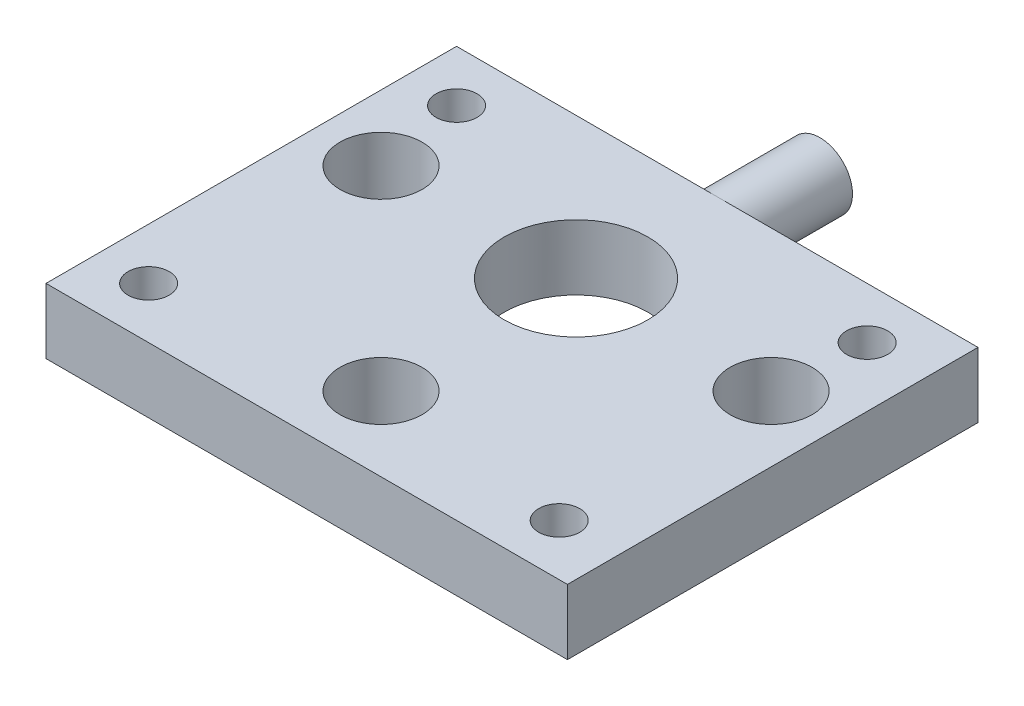
ISO-10303-21;
HEADER;
FILE_DESCRIPTION(('STEP AP214'),'2;1');
FILE_NAME('part.step','',(''),(''),'','','');
FILE_SCHEMA(('AUTOMOTIVE_DESIGN { 1 0 10303 214 1 1 1 1 }'));
ENDSEC;
DATA;
#1=APPLICATION_CONTEXT('core data for automotive mechanical design processes');
#2=APPLICATION_PROTOCOL_DEFINITION('international standard','automotive_design',2000,#1);
#3=PRODUCT_CONTEXT('',#1,'mechanical');
#4=PRODUCT('Part','Part','',(#3));
#5=PRODUCT_RELATED_PRODUCT_CATEGORY('part','',(#4));
#6=PRODUCT_DEFINITION_FORMATION('','',#4);
#7=PRODUCT_DEFINITION_CONTEXT('part definition',#1,'design');
#8=PRODUCT_DEFINITION('design','',#6,#7);
#9=PRODUCT_DEFINITION_SHAPE('','',#8);
#10=(LENGTH_UNIT() NAMED_UNIT(*) SI_UNIT(.MILLI.,.METRE.));
#11=(NAMED_UNIT(*) PLANE_ANGLE_UNIT() SI_UNIT($,.RADIAN.));
#12=(NAMED_UNIT(*) SI_UNIT($,.STERADIAN.) SOLID_ANGLE_UNIT());
#13=UNCERTAINTY_MEASURE_WITH_UNIT(LENGTH_MEASURE(1.E-05),#10,'distance_accuracy_value','');
#14=(GEOMETRIC_REPRESENTATION_CONTEXT(3) GLOBAL_UNCERTAINTY_ASSIGNED_CONTEXT((#13)) GLOBAL_UNIT_ASSIGNED_CONTEXT((#10,
#11,#12)) REPRESENTATION_CONTEXT('',''));
#15=CARTESIAN_POINT('',(0.,0.,0.));
#16=DIRECTION('',(0.,0.,1.));
#17=DIRECTION('',(1.,0.,0.));
#18=AXIS2_PLACEMENT_3D('',#15,#16,#17);
#19=CARTESIAN_POINT('',(0.,10.,-33.2265724491529));
#20=DIRECTION('',(0.,0.,-1.));
#21=DIRECTION('',(-1.,0.,0.));
#22=AXIS2_PLACEMENT_3D('',#19,#20,#21);
#23=PLANE('',#22);
#24=CARTESIAN_POINT('',(0.,3.175,-33.2265724491529));
#25=DIRECTION('',(0.,0.,-1.));
#26=DIRECTION('',(-1.,0.,0.));
#27=AXIS2_PLACEMENT_3D('',#24,#25,#26);
#28=CIRCLE('',#27,3.175);
#29=CARTESIAN_POINT('',(0.,6.35,-33.2265724491529));
#30=VERTEX_POINT('',#29);
#31=CARTESIAN_POINT('',(0.,0.,-33.2265724491529));
#32=VERTEX_POINT('',#31);
#33=EDGE_CURVE('E45',#30,#32,#28,.T.);
#34=ORIENTED_EDGE('',*,*,#33,.F.);
#35=DIRECTION('',(-1.,0.,0.));
#36=VECTOR('',#35,1.);
#37=CARTESIAN_POINT('',(0.,6.35,-33.2265724491529));
#38=LINE('',#37,#36);
#39=CARTESIAN_POINT('',(25.4,6.35,-33.2265724491529));
#40=VERTEX_POINT('',#39);
#41=EDGE_CURVE('E83',#40,#30,#38,.T.);
#42=ORIENTED_EDGE('',*,*,#41,.F.);
#43=DIRECTION('',(0.,-1.,0.));
#44=VECTOR('',#43,1.);
#45=CARTESIAN_POINT('',(25.4,10.,-33.2265724491529));
#46=LINE('',#45,#44);
#47=CARTESIAN_POINT('',(25.4,0.,-33.2265724491529));
#48=VERTEX_POINT('',#47);
#49=EDGE_CURVE('E99',#40,#48,#46,.T.);
#50=ORIENTED_EDGE('',*,*,#49,.T.);
#51=DIRECTION('',(1.,0.,0.));
#52=VECTOR('',#51,1.);
#53=CARTESIAN_POINT('',(0.,0.,-33.2265724491529));
#54=LINE('',#53,#52);
#55=EDGE_CURVE('E57',#32,#48,#54,.T.);
#56=ORIENTED_EDGE('',*,*,#55,.F.);
#57=EDGE_LOOP('',(#34,#42,#50,#56));
#58=FACE_BOUND('',#57,.T.);
#59=ADVANCED_FACE('F35',(#58),#23,.T.);
#60=CARTESIAN_POINT('',(25.4,6.35,-40.));
#61=DIRECTION('',(-1.,0.,0.));
#62=DIRECTION('',(0.,0.,1.));
#63=AXIS2_PLACEMENT_3D('',#60,#61,#62);
#64=PLANE('',#63);
#65=ORIENTED_EDGE('',*,*,#49,.F.);
#66=DIRECTION('',(0.,0.,-1.));
#67=VECTOR('',#66,1.);
#68=CARTESIAN_POINT('',(25.4,6.35,-40.));
#69=LINE('',#68,#67);
#70=CARTESIAN_POINT('',(25.4,6.35,6.77342755084709));
#71=VERTEX_POINT('',#70);
#72=EDGE_CURVE('E89',#71,#40,#69,.T.);
#73=ORIENTED_EDGE('',*,*,#72,.F.);
#74=DIRECTION('',(0.,1.,0.));
#75=VECTOR('',#74,1.);
#76=CARTESIAN_POINT('',(25.4,-3.65,6.77342755084709));
#77=LINE('',#76,#75);
#78=CARTESIAN_POINT('',(25.4,0.,6.77342755084709));
#79=VERTEX_POINT('',#78);
#80=EDGE_CURVE('E184',#79,#71,#77,.T.);
#81=ORIENTED_EDGE('',*,*,#80,.F.);
#82=DIRECTION('',(0.,0.,-1.));
#83=VECTOR('',#82,1.);
#84=CARTESIAN_POINT('',(25.4,0.,-40.));
#85=LINE('',#84,#83);
#86=EDGE_CURVE('E159',#79,#48,#85,.T.);
#87=ORIENTED_EDGE('',*,*,#86,.T.);
#88=EDGE_LOOP('',(#65,#73,#81,#87));
#89=FACE_BOUND('',#88,.T.);
#90=ADVANCED_FACE('F37',(#89),#64,.F.);
#91=CARTESIAN_POINT('',(-25.4,6.35,-40.));
#92=DIRECTION('',(1.,0.,0.));
#93=DIRECTION('',(0.,0.,-1.));
#94=AXIS2_PLACEMENT_3D('',#91,#92,#93);
#95=PLANE('',#94);
#96=DIRECTION('',(0.,-1.,0.));
#97=VECTOR('',#96,1.);
#98=CARTESIAN_POINT('',(-25.4,10.,-33.2265724491529));
#99=LINE('',#98,#97);
#100=CARTESIAN_POINT('',(-25.4,6.35,-33.2265724491529));
#101=VERTEX_POINT('',#100);
#102=CARTESIAN_POINT('',(-25.4,0.,-33.2265724491529));
#103=VERTEX_POINT('',#102);
#104=EDGE_CURVE('E97',#101,#103,#99,.T.);
#105=ORIENTED_EDGE('',*,*,#104,.T.);
#106=DIRECTION('',(0.,0.,1.));
#107=VECTOR('',#106,1.);
#108=CARTESIAN_POINT('',(-25.4,0.,-40.));
#109=LINE('',#108,#107);
#110=CARTESIAN_POINT('',(-25.4,0.,6.77342755084709));
#111=VERTEX_POINT('',#110);
#112=EDGE_CURVE('E153',#103,#111,#109,.T.);
#113=ORIENTED_EDGE('',*,*,#112,.T.);
#114=DIRECTION('',(0.,1.,0.));
#115=VECTOR('',#114,1.);
#116=CARTESIAN_POINT('',(-25.4,-3.65,6.77342755084709));
#117=LINE('',#116,#115);
#118=CARTESIAN_POINT('',(-25.4,6.35,6.77342755084709));
#119=VERTEX_POINT('',#118);
#120=EDGE_CURVE('E176',#111,#119,#117,.T.);
#121=ORIENTED_EDGE('',*,*,#120,.T.);
#122=DIRECTION('',(0.,0.,1.));
#123=VECTOR('',#122,1.);
#124=CARTESIAN_POINT('',(-25.4,6.35,-40.));
#125=LINE('',#124,#123);
#126=EDGE_CURVE('E155',#101,#119,#125,.T.);
#127=ORIENTED_EDGE('',*,*,#126,.F.);
#128=EDGE_LOOP('',(#105,#113,#121,#127));
#129=FACE_BOUND('',#128,.T.);
#130=ADVANCED_FACE('F123',(#129),#95,.F.);
#131=CARTESIAN_POINT('',(0.,6.35,0.));
#132=DIRECTION('',(0.,1.,0.));
#133=DIRECTION('',(0.,0.,1.));
#134=AXIS2_PLACEMENT_3D('',#131,#132,#133);
#135=PLANE('',#134);
#136=CARTESIAN_POINT('',(19.6,6.35,1.77342755084709));
#137=DIRECTION('',(0.,1.,0.));
#138=DIRECTION('',(0.,0.,1.));
#139=AXIS2_PLACEMENT_3D('',#136,#137,#138);
#140=CIRCLE('',#139,2.);
#141=CARTESIAN_POINT('',(19.6,6.35,3.77342755084709));
#142=VERTEX_POINT('',#141);
#143=EDGE_CURVE('E204',#142,#142,#140,.T.);
#144=ORIENTED_EDGE('',*,*,#143,.F.);
#145=EDGE_LOOP('',(#144));
#146=FACE_BOUND('',#145,.T.);
#147=CARTESIAN_POINT('',(19.6000000000003,6.35,-28.2265724491529));
#148=DIRECTION('',(0.,1.,0.));
#149=DIRECTION('',(0.,0.,1.));
#150=AXIS2_PLACEMENT_3D('',#147,#148,#149);
#151=CIRCLE('',#150,2.);
#152=CARTESIAN_POINT('',(19.6000000000003,6.35,-26.2265724491529));
#153=VERTEX_POINT('',#152);
#154=EDGE_CURVE('E207',#153,#153,#151,.T.);
#155=ORIENTED_EDGE('',*,*,#154,.F.);
#156=EDGE_LOOP('',(#155));
#157=FACE_BOUND('',#156,.T.);
#158=CARTESIAN_POINT('',(-20.3999999999997,6.35,-28.2265724491529));
#159=DIRECTION('',(0.,1.,0.));
#160=DIRECTION('',(0.,0.,1.));
#161=AXIS2_PLACEMENT_3D('',#158,#159,#160);
#162=CIRCLE('',#161,2.);
#163=CARTESIAN_POINT('',(-20.3999999999997,6.35,-26.2265724491529));
#164=VERTEX_POINT('',#163);
#165=EDGE_CURVE('E210',#164,#164,#162,.T.);
#166=ORIENTED_EDGE('',*,*,#165,.F.);
#167=EDGE_LOOP('',(#166));
#168=FACE_BOUND('',#167,.T.);
#169=CARTESIAN_POINT('',(-20.4,6.35,1.77342755084709));
#170=DIRECTION('',(0.,1.,0.));
#171=DIRECTION('',(0.,0.,1.));
#172=AXIS2_PLACEMENT_3D('',#169,#170,#171);
#173=CIRCLE('',#172,2.);
#174=CARTESIAN_POINT('',(-20.4,6.35,3.77342755084709));
#175=VERTEX_POINT('',#174);
#176=EDGE_CURVE('E198',#175,#175,#173,.T.);
#177=ORIENTED_EDGE('',*,*,#176,.F.);
#178=EDGE_LOOP('',(#177));
#179=FACE_BOUND('',#178,.T.);
#180=CARTESIAN_POINT('',(0.,6.35,-19.4660918494586));
#181=DIRECTION('',(0.,1.,0.));
#182=DIRECTION('',(0.,0.,1.));
#183=AXIS2_PLACEMENT_3D('',#180,#181,#182);
#184=CIRCLE('',#183,7.);
#185=CARTESIAN_POINT('',(0.,6.35,-12.4660918494586));
#186=VERTEX_POINT('',#185);
#187=EDGE_CURVE('E103',#186,#186,#184,.T.);
#188=ORIENTED_EDGE('',*,*,#187,.F.);
#189=EDGE_LOOP('',(#188));
#190=FACE_BOUND('',#189,.T.);
#191=CARTESIAN_POINT('',(19.,6.35,-19.4660918494586));
#192=DIRECTION('',(0.,1.,0.));
#193=DIRECTION('',(0.,0.,1.));
#194=AXIS2_PLACEMENT_3D('',#191,#192,#193);
#195=CIRCLE('',#194,4.);
#196=CARTESIAN_POINT('',(19.,6.35,-15.4660918494586));
#197=VERTEX_POINT('',#196);
#198=EDGE_CURVE('E179',#197,#197,#195,.T.);
#199=ORIENTED_EDGE('',*,*,#198,.F.);
#200=EDGE_LOOP('',(#199));
#201=FACE_BOUND('',#200,.T.);
#202=CARTESIAN_POINT('',(0.,6.35,-0.466091849458573));
#203=DIRECTION('',(0.,1.,0.));
#204=DIRECTION('',(0.,0.,1.));
#205=AXIS2_PLACEMENT_3D('',#202,#203,#204);
#206=CIRCLE('',#205,4.);
#207=CARTESIAN_POINT('',(0.,6.35,3.53390815054143));
#208=VERTEX_POINT('',#207);
#209=EDGE_CURVE('E172',#208,#208,#206,.T.);
#210=ORIENTED_EDGE('',*,*,#209,.F.);
#211=EDGE_LOOP('',(#210));
#212=FACE_BOUND('',#211,.T.);
#213=CARTESIAN_POINT('',(-19.,6.35,-19.4660918494586));
#214=DIRECTION('',(0.,1.,0.));
#215=DIRECTION('',(0.,0.,1.));
#216=AXIS2_PLACEMENT_3D('',#213,#214,#215);
#217=CIRCLE('',#216,4.);
#218=CARTESIAN_POINT('',(-19.,6.35,-15.4660918494586));
#219=VERTEX_POINT('',#218);
#220=EDGE_CURVE('E166',#219,#219,#217,.T.);
#221=ORIENTED_EDGE('',*,*,#220,.F.);
#222=EDGE_LOOP('',(#221));
#223=FACE_BOUND('',#222,.T.);
#224=ORIENTED_EDGE('',*,*,#72,.T.);
#225=ORIENTED_EDGE('',*,*,#41,.T.);
#226=EDGE_CURVE('E85',#30,#101,#38,.T.);
#227=ORIENTED_EDGE('',*,*,#226,.T.);
#228=ORIENTED_EDGE('',*,*,#126,.T.);
#229=DIRECTION('',(-1.,0.,0.));
#230=VECTOR('',#229,1.);
#231=CARTESIAN_POINT('',(-25.4,6.35,6.77342755084709));
#232=LINE('',#231,#230);
#233=EDGE_CURVE('E93',#71,#119,#232,.T.);
#234=ORIENTED_EDGE('',*,*,#233,.F.);
#235=EDGE_LOOP('',(#224,#225,#227,#228,#234));
#236=FACE_BOUND('',#235,.T.);
#237=ADVANCED_FACE('F84',(#146,#157,#168,#179,#190,#201,#212,#223,#236),#135,.T.);
#238=CARTESIAN_POINT('',(0.,0.,0.));
#239=DIRECTION('',(0.,1.,0.));
#240=DIRECTION('',(0.,0.,1.));
#241=AXIS2_PLACEMENT_3D('',#238,#239,#240);
#242=PLANE('',#241);
#243=CARTESIAN_POINT('',(19.6,0.,1.77342755084709));
#244=DIRECTION('',(0.,-1.,0.));
#245=DIRECTION('',(0.,0.,-1.));
#246=AXIS2_PLACEMENT_3D('',#243,#244,#245);
#247=CIRCLE('',#246,2.);
#248=CARTESIAN_POINT('',(19.6,0.,-0.226572449152912));
#249=VERTEX_POINT('',#248);
#250=EDGE_CURVE('E213',#249,#249,#247,.T.);
#251=ORIENTED_EDGE('',*,*,#250,.F.);
#252=EDGE_LOOP('',(#251));
#253=FACE_BOUND('',#252,.T.);
#254=CARTESIAN_POINT('',(19.6000000000003,0.,-28.2265724491529));
#255=DIRECTION('',(0.,-1.,0.));
#256=DIRECTION('',(0.,0.,-1.));
#257=AXIS2_PLACEMENT_3D('',#254,#255,#256);
#258=CIRCLE('',#257,2.);
#259=CARTESIAN_POINT('',(19.6000000000003,0.,-30.2265724491529));
#260=VERTEX_POINT('',#259);
#261=EDGE_CURVE('E217',#260,#260,#258,.T.);
#262=ORIENTED_EDGE('',*,*,#261,.F.);
#263=EDGE_LOOP('',(#262));
#264=FACE_BOUND('',#263,.T.);
#265=CARTESIAN_POINT('',(-20.3999999999997,0.,-28.2265724491529));
#266=DIRECTION('',(0.,-1.,0.));
#267=DIRECTION('',(0.,0.,-1.));
#268=AXIS2_PLACEMENT_3D('',#265,#266,#267);
#269=CIRCLE('',#268,2.);
#270=CARTESIAN_POINT('',(-20.3999999999997,0.,-30.2265724491529));
#271=VERTEX_POINT('',#270);
#272=EDGE_CURVE('E214',#271,#271,#269,.T.);
#273=ORIENTED_EDGE('',*,*,#272,.F.);
#274=EDGE_LOOP('',(#273));
#275=FACE_BOUND('',#274,.T.);
#276=CARTESIAN_POINT('',(-20.4,0.,1.77342755084709));
#277=DIRECTION('',(0.,-1.,0.));
#278=DIRECTION('',(0.,0.,-1.));
#279=AXIS2_PLACEMENT_3D('',#276,#277,#278);
#280=CIRCLE('',#279,2.);
#281=CARTESIAN_POINT('',(-20.4,0.,-0.226572449152912));
#282=VERTEX_POINT('',#281);
#283=EDGE_CURVE('E201',#282,#282,#280,.T.);
#284=ORIENTED_EDGE('',*,*,#283,.F.);
#285=EDGE_LOOP('',(#284));
#286=FACE_BOUND('',#285,.T.);
#287=CARTESIAN_POINT('',(0.,0.,-19.4660918494586));
#288=DIRECTION('',(0.,-1.,0.));
#289=DIRECTION('',(0.,0.,-1.));
#290=AXIS2_PLACEMENT_3D('',#287,#288,#289);
#291=CIRCLE('',#290,7.);
#292=CARTESIAN_POINT('',(0.,0.,-26.4660918494586));
#293=VERTEX_POINT('',#292);
#294=EDGE_CURVE('E195',#293,#293,#291,.T.);
#295=ORIENTED_EDGE('',*,*,#294,.F.);
#296=EDGE_LOOP('',(#295));
#297=FACE_BOUND('',#296,.T.);
#298=CARTESIAN_POINT('',(-19.,0.,-19.4660918494586));
#299=DIRECTION('',(0.,1.,0.));
#300=DIRECTION('',(0.,0.,1.));
#301=AXIS2_PLACEMENT_3D('',#298,#299,#300);
#302=CIRCLE('',#301,4.);
#303=CARTESIAN_POINT('',(-19.,0.,-15.4660918494586));
#304=VERTEX_POINT('',#303);
#305=EDGE_CURVE('E162',#304,#304,#302,.T.);
#306=ORIENTED_EDGE('',*,*,#305,.T.);
#307=EDGE_LOOP('',(#306));
#308=FACE_BOUND('',#307,.T.);
#309=CARTESIAN_POINT('',(0.,0.,-0.466091849458573));
#310=DIRECTION('',(0.,1.,0.));
#311=DIRECTION('',(0.,0.,1.));
#312=AXIS2_PLACEMENT_3D('',#309,#310,#311);
#313=CIRCLE('',#312,4.);
#314=CARTESIAN_POINT('',(0.,0.,3.53390815054143));
#315=VERTEX_POINT('',#314);
#316=EDGE_CURVE('E175',#315,#315,#313,.T.);
#317=ORIENTED_EDGE('',*,*,#316,.T.);
#318=EDGE_LOOP('',(#317));
#319=FACE_BOUND('',#318,.T.);
#320=CARTESIAN_POINT('',(19.,0.,-19.4660918494586));
#321=DIRECTION('',(0.,1.,0.));
#322=DIRECTION('',(0.,0.,1.));
#323=AXIS2_PLACEMENT_3D('',#320,#321,#322);
#324=CIRCLE('',#323,4.);
#325=CARTESIAN_POINT('',(19.,0.,-15.4660918494586));
#326=VERTEX_POINT('',#325);
#327=EDGE_CURVE('E169',#326,#326,#324,.T.);
#328=ORIENTED_EDGE('',*,*,#327,.T.);
#329=EDGE_LOOP('',(#328));
#330=FACE_BOUND('',#329,.T.);
#331=EDGE_CURVE('E156',#103,#32,#54,.T.);
#332=ORIENTED_EDGE('',*,*,#331,.T.);
#333=ORIENTED_EDGE('',*,*,#55,.T.);
#334=ORIENTED_EDGE('',*,*,#86,.F.);
#335=DIRECTION('',(-1.,0.,0.));
#336=VECTOR('',#335,1.);
#337=CARTESIAN_POINT('',(0.,0.,6.77342755084709));
#338=LINE('',#337,#336);
#339=EDGE_CURVE('E39',#79,#111,#338,.T.);
#340=ORIENTED_EDGE('',*,*,#339,.T.);
#341=ORIENTED_EDGE('',*,*,#112,.F.);
#342=EDGE_LOOP('',(#332,#333,#334,#340,#341));
#343=FACE_BOUND('',#342,.T.);
#344=ADVANCED_FACE('F140',(#253,#264,#275,#286,#297,#308,#319,#330,#343),#242,.F.);
#345=CARTESIAN_POINT('',(-19.,0.,-19.4660918494586));
#346=DIRECTION('',(0.,1.,0.));
#347=DIRECTION('',(0.,0.,1.));
#348=AXIS2_PLACEMENT_3D('',#345,#346,#347);
#349=CYLINDRICAL_SURFACE('',#348,4.);
#350=ORIENTED_EDGE('',*,*,#305,.F.);
#351=EDGE_LOOP('',(#350));
#352=FACE_BOUND('',#351,.T.);
#353=ORIENTED_EDGE('',*,*,#220,.T.);
#354=EDGE_LOOP('',(#353));
#355=FACE_BOUND('',#354,.T.);
#356=ADVANCED_FACE('F136',(#352,#355),#349,.F.);
#357=CARTESIAN_POINT('',(0.,0.,-0.466091849458573));
#358=DIRECTION('',(0.,1.,0.));
#359=DIRECTION('',(0.,0.,1.));
#360=AXIS2_PLACEMENT_3D('',#357,#358,#359);
#361=CYLINDRICAL_SURFACE('',#360,4.);
#362=ORIENTED_EDGE('',*,*,#316,.F.);
#363=EDGE_LOOP('',(#362));
#364=FACE_BOUND('',#363,.T.);
#365=ORIENTED_EDGE('',*,*,#209,.T.);
#366=EDGE_LOOP('',(#365));
#367=FACE_BOUND('',#366,.T.);
#368=ADVANCED_FACE('F132',(#364,#367),#361,.F.);
#369=CARTESIAN_POINT('',(19.,0.,-19.4660918494586));
#370=DIRECTION('',(0.,1.,0.));
#371=DIRECTION('',(0.,0.,1.));
#372=AXIS2_PLACEMENT_3D('',#369,#370,#371);
#373=CYLINDRICAL_SURFACE('',#372,4.);
#374=ORIENTED_EDGE('',*,*,#327,.F.);
#375=EDGE_LOOP('',(#374));
#376=FACE_BOUND('',#375,.T.);
#377=ORIENTED_EDGE('',*,*,#198,.T.);
#378=EDGE_LOOP('',(#377));
#379=FACE_BOUND('',#378,.T.);
#380=ADVANCED_FACE('F128',(#376,#379),#373,.F.);
#381=CARTESIAN_POINT('',(-25.4,-3.65,6.77342755084709));
#382=DIRECTION('',(0.,0.,-1.));
#383=DIRECTION('',(-1.,0.,0.));
#384=AXIS2_PLACEMENT_3D('',#381,#382,#383);
#385=PLANE('',#384);
#386=ORIENTED_EDGE('',*,*,#80,.T.);
#387=ORIENTED_EDGE('',*,*,#233,.T.);
#388=ORIENTED_EDGE('',*,*,#120,.F.);
#389=ORIENTED_EDGE('',*,*,#339,.F.);
#390=EDGE_LOOP('',(#386,#387,#388,#389));
#391=FACE_BOUND('',#390,.T.);
#392=ADVANCED_FACE('F116',(#391),#385,.F.);
#393=EDGE_CURVE('E11',#32,#30,#28,.T.);
#394=ORIENTED_EDGE('',*,*,#393,.F.);
#395=ORIENTED_EDGE('',*,*,#331,.F.);
#396=ORIENTED_EDGE('',*,*,#104,.F.);
#397=ORIENTED_EDGE('',*,*,#226,.F.);
#398=EDGE_LOOP('',(#394,#395,#396,#397));
#399=FACE_BOUND('',#398,.T.);
#400=ADVANCED_FACE('F95',(#399),#23,.T.);
#401=CARTESIAN_POINT('',(0.,3.175,-43.2265724491529));
#402=DIRECTION('',(0.,0.,1.));
#403=DIRECTION('',(1.,0.,0.));
#404=AXIS2_PLACEMENT_3D('',#401,#402,#403);
#405=CYLINDRICAL_SURFACE('',#404,3.175);
#406=CARTESIAN_POINT('',(0.,3.175,-43.2265724491529));
#407=DIRECTION('',(0.,0.,-1.));
#408=DIRECTION('',(-1.,0.,0.));
#409=AXIS2_PLACEMENT_3D('',#406,#407,#408);
#410=CIRCLE('',#409,3.175);
#411=CARTESIAN_POINT('',(-3.175,3.175,-43.2265724491529));
#412=VERTEX_POINT('',#411);
#413=EDGE_CURVE('E102',#412,#412,#410,.T.);
#414=ORIENTED_EDGE('',*,*,#413,.F.);
#415=EDGE_LOOP('',(#414));
#416=FACE_BOUND('',#415,.T.);
#417=ORIENTED_EDGE('',*,*,#33,.T.);
#418=ORIENTED_EDGE('',*,*,#393,.T.);
#419=EDGE_LOOP('',(#417,#418));
#420=FACE_BOUND('',#419,.T.);
#421=ADVANCED_FACE('F104',(#416,#420),#405,.T.);
#422=CARTESIAN_POINT('',(0.,3.175,-43.2265724491529));
#423=DIRECTION('',(0.,0.,-1.));
#424=DIRECTION('',(-1.,0.,0.));
#425=AXIS2_PLACEMENT_3D('',#422,#423,#424);
#426=PLANE('',#425);
#427=ORIENTED_EDGE('',*,*,#413,.T.);
#428=EDGE_LOOP('',(#427));
#429=FACE_BOUND('',#428,.T.);
#430=ADVANCED_FACE('F106',(#429),#426,.T.);
#431=CARTESIAN_POINT('',(0.,10.,-19.4660918494586));
#432=DIRECTION('',(0.,-1.,0.));
#433=DIRECTION('',(0.,0.,-1.));
#434=AXIS2_PLACEMENT_3D('',#431,#432,#433);
#435=CYLINDRICAL_SURFACE('',#434,7.);
#436=ORIENTED_EDGE('',*,*,#187,.T.);
#437=EDGE_LOOP('',(#436));
#438=FACE_BOUND('',#437,.T.);
#439=ORIENTED_EDGE('',*,*,#294,.T.);
#440=EDGE_LOOP('',(#439));
#441=FACE_BOUND('',#440,.T.);
#442=ADVANCED_FACE('F113',(#438,#441),#435,.F.);
#443=CARTESIAN_POINT('',(-20.4,10.,1.77342755084709));
#444=DIRECTION('',(0.,-1.,0.));
#445=DIRECTION('',(0.,0.,-1.));
#446=AXIS2_PLACEMENT_3D('',#443,#444,#445);
#447=CYLINDRICAL_SURFACE('',#446,2.);
#448=ORIENTED_EDGE('',*,*,#176,.T.);
#449=EDGE_LOOP('',(#448));
#450=FACE_BOUND('',#449,.T.);
#451=ORIENTED_EDGE('',*,*,#283,.T.);
#452=EDGE_LOOP('',(#451));
#453=FACE_BOUND('',#452,.T.);
#454=ADVANCED_FACE('F249',(#450,#453),#447,.F.);
#455=CARTESIAN_POINT('',(-20.3999999999997,10.,-28.2265724491529));
#456=DIRECTION('',(0.,-1.,0.));
#457=DIRECTION('',(0.,0.,-1.));
#458=AXIS2_PLACEMENT_3D('',#455,#456,#457);
#459=CYLINDRICAL_SURFACE('',#458,2.);
#460=ORIENTED_EDGE('',*,*,#165,.T.);
#461=EDGE_LOOP('',(#460));
#462=FACE_BOUND('',#461,.T.);
#463=ORIENTED_EDGE('',*,*,#272,.T.);
#464=EDGE_LOOP('',(#463));
#465=FACE_BOUND('',#464,.T.);
#466=ADVANCED_FACE('F255',(#462,#465),#459,.F.);
#467=CARTESIAN_POINT('',(19.6000000000003,10.,-28.2265724491529));
#468=DIRECTION('',(0.,-1.,0.));
#469=DIRECTION('',(0.,0.,-1.));
#470=AXIS2_PLACEMENT_3D('',#467,#468,#469);
#471=CYLINDRICAL_SURFACE('',#470,2.);
#472=ORIENTED_EDGE('',*,*,#154,.T.);
#473=EDGE_LOOP('',(#472));
#474=FACE_BOUND('',#473,.T.);
#475=ORIENTED_EDGE('',*,*,#261,.T.);
#476=EDGE_LOOP('',(#475));
#477=FACE_BOUND('',#476,.T.);
#478=ADVANCED_FACE('F261',(#474,#477),#471,.F.);
#479=CARTESIAN_POINT('',(19.6,10.,1.77342755084709));
#480=DIRECTION('',(0.,-1.,0.));
#481=DIRECTION('',(0.,0.,-1.));
#482=AXIS2_PLACEMENT_3D('',#479,#480,#481);
#483=CYLINDRICAL_SURFACE('',#482,2.);
#484=ORIENTED_EDGE('',*,*,#143,.T.);
#485=EDGE_LOOP('',(#484));
#486=FACE_BOUND('',#485,.T.);
#487=ORIENTED_EDGE('',*,*,#250,.T.);
#488=EDGE_LOOP('',(#487));
#489=FACE_BOUND('',#488,.T.);
#490=ADVANCED_FACE('F223',(#486,#489),#483,.F.);
#491=CLOSED_SHELL('',(#59,#90,#130,#237,#344,#356,#368,#380,#392,#400,#421,#430,#442,#454,#466,
#478,#490));
#492=MANIFOLD_SOLID_BREP('B2',#491);
#493=ADVANCED_BREP_SHAPE_REPRESENTATION('',(#18,#492),#14);
#494=SHAPE_DEFINITION_REPRESENTATION(#9,#493);
ENDSEC;
END-ISO-10303-21;
